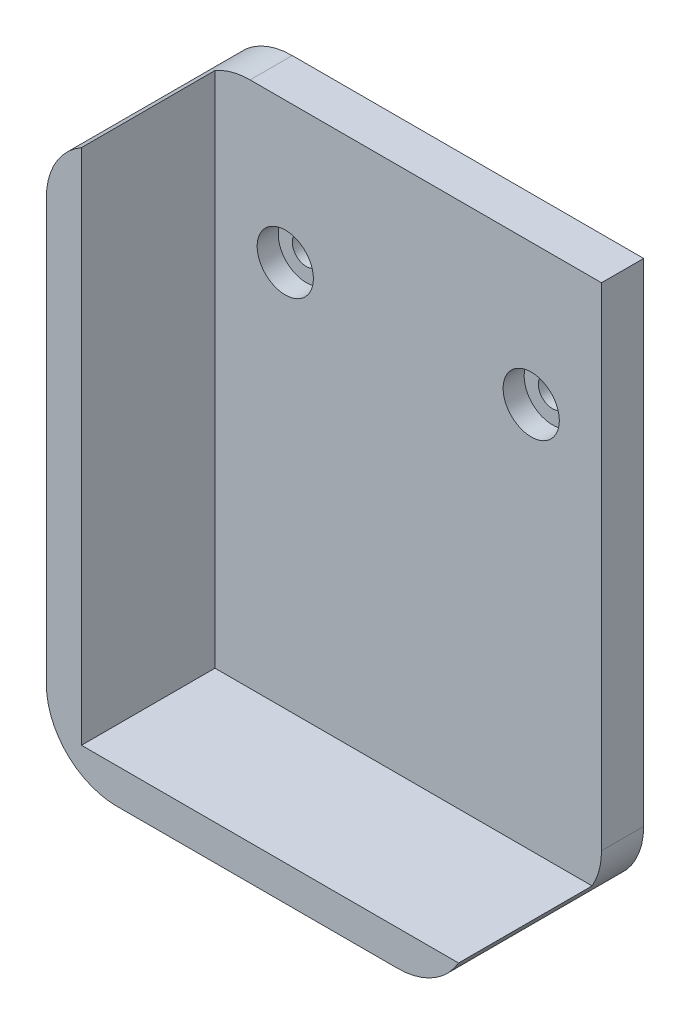
ISO-10303-21;
HEADER;
FILE_DESCRIPTION(('STEP AP214'),'2;1');
FILE_NAME('part.step','',(''),(''),'','','');
FILE_SCHEMA(('AUTOMOTIVE_DESIGN { 1 0 10303 214 1 1 1 1 }'));
ENDSEC;
DATA;
#1=APPLICATION_CONTEXT('core data for automotive mechanical design processes');
#2=APPLICATION_PROTOCOL_DEFINITION('international standard','automotive_design',2000,#1);
#3=PRODUCT_CONTEXT('',#1,'mechanical');
#4=PRODUCT('Part','Part','',(#3));
#5=PRODUCT_RELATED_PRODUCT_CATEGORY('part','',(#4));
#6=PRODUCT_DEFINITION_FORMATION('','',#4);
#7=PRODUCT_DEFINITION_CONTEXT('part definition',#1,'design');
#8=PRODUCT_DEFINITION('design','',#6,#7);
#9=PRODUCT_DEFINITION_SHAPE('','',#8);
#10=(LENGTH_UNIT() NAMED_UNIT(*) SI_UNIT(.MILLI.,.METRE.));
#11=(NAMED_UNIT(*) PLANE_ANGLE_UNIT() SI_UNIT($,.RADIAN.));
#12=(NAMED_UNIT(*) SI_UNIT($,.STERADIAN.) SOLID_ANGLE_UNIT());
#13=UNCERTAINTY_MEASURE_WITH_UNIT(LENGTH_MEASURE(1.E-05),#10,'distance_accuracy_value','');
#14=(GEOMETRIC_REPRESENTATION_CONTEXT(3) GLOBAL_UNCERTAINTY_ASSIGNED_CONTEXT((#13)) GLOBAL_UNIT_ASSIGNED_CONTEXT((#10,
#11,#12)) REPRESENTATION_CONTEXT('',''));
#15=CARTESIAN_POINT('',(0.,0.,0.));
#16=DIRECTION('',(0.,0.,1.));
#17=DIRECTION('',(1.,0.,0.));
#18=AXIS2_PLACEMENT_3D('',#15,#16,#17);
#19=CARTESIAN_POINT('',(60.,0.,6.));
#20=DIRECTION('',(1.,0.,0.));
#21=DIRECTION('',(0.,1.,0.));
#22=AXIS2_PLACEMENT_3D('',#19,#20,#21);
#23=PLANE('',#22);
#24=DIRECTION('',(0.,-1.,0.));
#25=VECTOR('',#24,1.);
#26=CARTESIAN_POINT('',(60.,0.,6.));
#27=LINE('',#26,#25);
#28=CARTESIAN_POINT('',(60.,80.,6.));
#29=VERTEX_POINT('',#28);
#30=CARTESIAN_POINT('',(60.,10.,6.));
#31=VERTEX_POINT('',#30);
#32=EDGE_CURVE('E153',#29,#31,#27,.T.);
#33=ORIENTED_EDGE('',*,*,#32,.T.);
#34=DIRECTION('',(0.,0.,-1.));
#35=VECTOR('',#34,1.);
#36=CARTESIAN_POINT('',(60.,10.,0.));
#37=LINE('',#36,#35);
#38=CARTESIAN_POINT('',(60.,10.,0.));
#39=VERTEX_POINT('',#38);
#40=EDGE_CURVE('E177',#31,#39,#37,.T.);
#41=ORIENTED_EDGE('',*,*,#40,.T.);
#42=DIRECTION('',(0.,-1.,0.));
#43=VECTOR('',#42,1.);
#44=CARTESIAN_POINT('',(60.,0.,0.));
#45=LINE('',#44,#43);
#46=CARTESIAN_POINT('',(60.,80.,0.));
#47=VERTEX_POINT('',#46);
#48=EDGE_CURVE('E152',#47,#39,#45,.T.);
#49=ORIENTED_EDGE('',*,*,#48,.F.);
#50=DIRECTION('',(0.,0.,-1.));
#51=VECTOR('',#50,1.);
#52=CARTESIAN_POINT('',(60.,80.,6.));
#53=LINE('',#52,#51);
#54=EDGE_CURVE('E159',#29,#47,#53,.T.);
#55=ORIENTED_EDGE('',*,*,#54,.F.);
#56=EDGE_LOOP('',(#33,#41,#49,#55));
#57=FACE_BOUND('',#56,.T.);
#58=ADVANCED_FACE('F39',(#57),#23,.T.);
#59=CARTESIAN_POINT('',(0.,80.,6.));
#60=DIRECTION('',(0.,1.,0.));
#61=DIRECTION('',(0.,0.,1.));
#62=AXIS2_PLACEMENT_3D('',#59,#60,#61);
#63=PLANE('',#62);
#64=DIRECTION('',(1.,0.,0.));
#65=VECTOR('',#64,1.);
#66=CARTESIAN_POINT('',(0.,80.,0.));
#67=LINE('',#66,#65);
#68=CARTESIAN_POINT('',(10.,80.,0.));
#69=VERTEX_POINT('',#68);
#70=EDGE_CURVE('E162',#69,#47,#67,.T.);
#71=ORIENTED_EDGE('',*,*,#70,.F.);
#72=DIRECTION('',(0.,0.,-1.));
#73=VECTOR('',#72,1.);
#74=CARTESIAN_POINT('',(10.,80.,6.));
#75=LINE('',#74,#73);
#76=CARTESIAN_POINT('',(10.,80.,6.));
#77=VERTEX_POINT('',#76);
#78=EDGE_CURVE('E47',#69,#77,#75,.F.);
#79=ORIENTED_EDGE('',*,*,#78,.T.);
#80=DIRECTION('',(1.,0.,0.));
#81=VECTOR('',#80,1.);
#82=CARTESIAN_POINT('',(0.,80.,6.));
#83=LINE('',#82,#81);
#84=EDGE_CURVE('E156',#77,#29,#83,.T.);
#85=ORIENTED_EDGE('',*,*,#84,.T.);
#86=ORIENTED_EDGE('',*,*,#54,.T.);
#87=EDGE_LOOP('',(#71,#79,#85,#86));
#88=FACE_BOUND('',#87,.T.);
#89=ADVANCED_FACE('F238',(#88),#63,.T.);
#90=CARTESIAN_POINT('',(0.,0.,6.));
#91=DIRECTION('',(-1.,0.,0.));
#92=DIRECTION('',(0.,0.,1.));
#93=AXIS2_PLACEMENT_3D('',#90,#91,#92);
#94=PLANE('',#93);
#95=DIRECTION('',(0.,1.,0.));
#96=VECTOR('',#95,1.);
#97=CARTESIAN_POINT('',(0.,0.,25.));
#98=LINE('',#97,#96);
#99=CARTESIAN_POINT('',(0.,10.,25.));
#100=VERTEX_POINT('',#99);
#101=CARTESIAN_POINT('',(0.,70.,25.));
#102=VERTEX_POINT('',#101);
#103=EDGE_CURVE('E124',#100,#102,#98,.T.);
#104=ORIENTED_EDGE('',*,*,#103,.T.);
#105=DIRECTION('',(0.,0.,-1.));
#106=VECTOR('',#105,1.);
#107=CARTESIAN_POINT('',(0.,70.,6.));
#108=LINE('',#107,#106);
#109=CARTESIAN_POINT('',(0.,70.,0.));
#110=VERTEX_POINT('',#109);
#111=EDGE_CURVE('E203',#102,#110,#108,.T.);
#112=ORIENTED_EDGE('',*,*,#111,.T.);
#113=DIRECTION('',(0.,1.,0.));
#114=VECTOR('',#113,1.);
#115=CARTESIAN_POINT('',(0.,0.,0.));
#116=LINE('',#115,#114);
#117=CARTESIAN_POINT('',(0.,10.,0.));
#118=VERTEX_POINT('',#117);
#119=EDGE_CURVE('E164',#118,#110,#116,.T.);
#120=ORIENTED_EDGE('',*,*,#119,.F.);
#121=DIRECTION('',(0.,0.,-1.));
#122=VECTOR('',#121,1.);
#123=CARTESIAN_POINT('',(0.,10.,25.));
#124=LINE('',#123,#122);
#125=EDGE_CURVE('E201',#118,#100,#124,.F.);
#126=ORIENTED_EDGE('',*,*,#125,.T.);
#127=EDGE_LOOP('',(#104,#112,#120,#126));
#128=FACE_BOUND('',#127,.T.);
#129=ADVANCED_FACE('F208',(#128),#94,.T.);
#130=CARTESIAN_POINT('',(0.,0.,6.));
#131=DIRECTION('',(0.,1.,0.));
#132=DIRECTION('',(0.,0.,1.));
#133=AXIS2_PLACEMENT_3D('',#130,#131,#132);
#134=PLANE('',#133);
#135=DIRECTION('',(1.,0.,0.));
#136=VECTOR('',#135,1.);
#137=CARTESIAN_POINT('',(0.,0.,0.));
#138=LINE('',#137,#136);
#139=CARTESIAN_POINT('',(10.,0.,0.));
#140=VERTEX_POINT('',#139);
#141=CARTESIAN_POINT('',(50.,0.,0.));
#142=VERTEX_POINT('',#141);
#143=EDGE_CURVE('E157',#140,#142,#138,.T.);
#144=ORIENTED_EDGE('',*,*,#143,.T.);
#145=DIRECTION('',(0.,0.,-1.));
#146=VECTOR('',#145,1.);
#147=CARTESIAN_POINT('',(50.,0.,25.));
#148=LINE('',#147,#146);
#149=CARTESIAN_POINT('',(50.,0.,25.));
#150=VERTEX_POINT('',#149);
#151=EDGE_CURVE('E189',#142,#150,#148,.F.);
#152=ORIENTED_EDGE('',*,*,#151,.T.);
#153=DIRECTION('',(1.,0.,0.));
#154=VECTOR('',#153,1.);
#155=CARTESIAN_POINT('',(0.,0.,25.));
#156=LINE('',#155,#154);
#157=CARTESIAN_POINT('',(10.,0.,25.));
#158=VERTEX_POINT('',#157);
#159=EDGE_CURVE('E134',#158,#150,#156,.T.);
#160=ORIENTED_EDGE('',*,*,#159,.F.);
#161=DIRECTION('',(0.,0.,-1.));
#162=VECTOR('',#161,1.);
#163=CARTESIAN_POINT('',(10.,0.,0.));
#164=LINE('',#163,#162);
#165=EDGE_CURVE('E186',#158,#140,#164,.T.);
#166=ORIENTED_EDGE('',*,*,#165,.T.);
#167=EDGE_LOOP('',(#144,#152,#160,#166));
#168=FACE_BOUND('',#167,.T.);
#169=ADVANCED_FACE('F221',(#168),#134,.F.);
#170=CARTESIAN_POINT('',(0.,0.,6.));
#171=DIRECTION('',(0.,0.,1.));
#172=DIRECTION('',(1.,0.,0.));
#173=AXIS2_PLACEMENT_3D('',#170,#171,#172);
#174=PLANE('',#173);
#175=CARTESIAN_POINT('',(50.,60.,6.));
#176=DIRECTION('',(0.,0.,1.));
#177=DIRECTION('',(1.,0.,0.));
#178=AXIS2_PLACEMENT_3D('',#175,#176,#177);
#179=CIRCLE('',#178,4.00000000000001);
#180=CARTESIAN_POINT('',(54.,60.,6.));
#181=VERTEX_POINT('',#180);
#182=EDGE_CURVE('E140',#181,#181,#179,.F.);
#183=ORIENTED_EDGE('',*,*,#182,.T.);
#184=EDGE_LOOP('',(#183));
#185=FACE_BOUND('',#184,.T.);
#186=CARTESIAN_POINT('',(15.,60.,6.));
#187=DIRECTION('',(0.,0.,1.));
#188=DIRECTION('',(1.,0.,0.));
#189=AXIS2_PLACEMENT_3D('',#186,#187,#188);
#190=CIRCLE('',#189,3.99999999999999);
#191=CARTESIAN_POINT('',(19.,60.,6.));
#192=VERTEX_POINT('',#191);
#193=EDGE_CURVE('E143',#192,#192,#190,.F.);
#194=ORIENTED_EDGE('',*,*,#193,.T.);
#195=EDGE_LOOP('',(#194));
#196=FACE_BOUND('',#195,.T.);
#197=DIRECTION('',(-1.,0.,0.));
#198=VECTOR('',#197,1.);
#199=CARTESIAN_POINT('',(0.,5.,6.));
#200=LINE('',#199,#198);
#201=CARTESIAN_POINT('',(58.6602540378444,5.,6.));
#202=VERTEX_POINT('',#201);
#203=CARTESIAN_POINT('',(5.,5.,6.));
#204=VERTEX_POINT('',#203);
#205=EDGE_CURVE('E132',#202,#204,#200,.T.);
#206=ORIENTED_EDGE('',*,*,#205,.F.);
#207=CARTESIAN_POINT('',(50.,10.,6.));
#208=DIRECTION('',(0.,0.,1.));
#209=DIRECTION('',(1.,0.,0.));
#210=AXIS2_PLACEMENT_3D('',#207,#208,#209);
#211=CIRCLE('',#210,10.);
#212=EDGE_CURVE('E199',#202,#31,#211,.T.);
#213=ORIENTED_EDGE('',*,*,#212,.T.);
#214=ORIENTED_EDGE('',*,*,#32,.F.);
#215=ORIENTED_EDGE('',*,*,#84,.F.);
#216=CARTESIAN_POINT('',(10.,70.,6.));
#217=DIRECTION('',(0.,0.,1.));
#218=DIRECTION('',(1.,0.,0.));
#219=AXIS2_PLACEMENT_3D('',#216,#217,#218);
#220=CIRCLE('',#219,10.);
#221=CARTESIAN_POINT('',(4.99999999999999,78.6602540378444,6.));
#222=VERTEX_POINT('',#221);
#223=EDGE_CURVE('E54',#77,#222,#220,.T.);
#224=ORIENTED_EDGE('',*,*,#223,.T.);
#225=DIRECTION('',(0.,1.,0.));
#226=VECTOR('',#225,1.);
#227=CARTESIAN_POINT('',(5.,0.,6.));
#228=LINE('',#227,#226);
#229=EDGE_CURVE('E133',#204,#222,#228,.T.);
#230=ORIENTED_EDGE('',*,*,#229,.F.);
#231=EDGE_LOOP('',(#206,#213,#214,#215,#224,#230));
#232=FACE_BOUND('',#231,.T.);
#233=ADVANCED_FACE('F227',(#185,#196,#232),#174,.T.);
#234=CARTESIAN_POINT('',(0.,0.,0.));
#235=DIRECTION('',(0.,0.,1.));
#236=DIRECTION('',(1.,0.,0.));
#237=AXIS2_PLACEMENT_3D('',#234,#235,#236);
#238=PLANE('',#237);
#239=ORIENTED_EDGE('',*,*,#48,.T.);
#240=CARTESIAN_POINT('',(50.,10.,0.));
#241=DIRECTION('',(0.,0.,1.));
#242=DIRECTION('',(1.,0.,0.));
#243=AXIS2_PLACEMENT_3D('',#240,#241,#242);
#244=CIRCLE('',#243,10.);
#245=EDGE_CURVE('E184',#39,#142,#244,.F.);
#246=ORIENTED_EDGE('',*,*,#245,.T.);
#247=ORIENTED_EDGE('',*,*,#143,.F.);
#248=CARTESIAN_POINT('',(10.,10.,0.));
#249=DIRECTION('',(0.,0.,1.));
#250=DIRECTION('',(1.,0.,0.));
#251=AXIS2_PLACEMENT_3D('',#248,#249,#250);
#252=CIRCLE('',#251,10.);
#253=EDGE_CURVE('E180',#140,#118,#252,.F.);
#254=ORIENTED_EDGE('',*,*,#253,.T.);
#255=ORIENTED_EDGE('',*,*,#119,.T.);
#256=CARTESIAN_POINT('',(10.,70.,0.));
#257=DIRECTION('',(0.,0.,1.));
#258=DIRECTION('',(1.,0.,0.));
#259=AXIS2_PLACEMENT_3D('',#256,#257,#258);
#260=CIRCLE('',#259,10.);
#261=EDGE_CURVE('E182',#110,#69,#260,.F.);
#262=ORIENTED_EDGE('',*,*,#261,.T.);
#263=ORIENTED_EDGE('',*,*,#70,.T.);
#264=EDGE_LOOP('',(#239,#246,#247,#254,#255,#262,#263));
#265=FACE_BOUND('',#264,.T.);
#266=CARTESIAN_POINT('',(50.,60.,0.));
#267=DIRECTION('',(0.,0.,1.));
#268=DIRECTION('',(1.,0.,0.));
#269=AXIS2_PLACEMENT_3D('',#266,#267,#268);
#270=CIRCLE('',#269,2.);
#271=CARTESIAN_POINT('',(52.,60.,0.));
#272=VERTEX_POINT('',#271);
#273=EDGE_CURVE('E296',#272,#272,#270,.T.);
#274=ORIENTED_EDGE('',*,*,#273,.T.);
#275=EDGE_LOOP('',(#274));
#276=FACE_BOUND('',#275,.T.);
#277=CARTESIAN_POINT('',(15.,60.,0.));
#278=DIRECTION('',(0.,0.,1.));
#279=DIRECTION('',(1.,0.,0.));
#280=AXIS2_PLACEMENT_3D('',#277,#278,#279);
#281=CIRCLE('',#280,2.00000000000001);
#282=CARTESIAN_POINT('',(17.,60.,0.));
#283=VERTEX_POINT('',#282);
#284=EDGE_CURVE('E301',#283,#283,#281,.T.);
#285=ORIENTED_EDGE('',*,*,#284,.T.);
#286=EDGE_LOOP('',(#285));
#287=FACE_BOUND('',#286,.T.);
#288=ADVANCED_FACE('F213',(#265,#276,#287),#238,.F.);
#289=CARTESIAN_POINT('',(0.,5.,25.));
#290=DIRECTION('',(0.,1.,0.));
#291=DIRECTION('',(0.,0.,1.));
#292=AXIS2_PLACEMENT_3D('',#289,#290,#291);
#293=PLANE('',#292);
#294=DIRECTION('',(1.,0.,0.));
#295=VECTOR('',#294,1.);
#296=CARTESIAN_POINT('',(0.,5.,25.));
#297=LINE('',#296,#295);
#298=CARTESIAN_POINT('',(5.,5.,25.));
#299=VERTEX_POINT('',#298);
#300=CARTESIAN_POINT('',(58.6602540378444,5.,25.));
#301=VERTEX_POINT('',#300);
#302=EDGE_CURVE('E125',#299,#301,#297,.T.);
#303=ORIENTED_EDGE('',*,*,#302,.T.);
#304=DIRECTION('',(0.,0.,1.));
#305=VECTOR('',#304,1.);
#306=CARTESIAN_POINT('',(58.6602540378444,5.,25.));
#307=LINE('',#306,#305);
#308=EDGE_CURVE('E196',#301,#202,#307,.F.);
#309=ORIENTED_EDGE('',*,*,#308,.T.);
#310=ORIENTED_EDGE('',*,*,#205,.T.);
#311=DIRECTION('',(0.,0.,-1.));
#312=VECTOR('',#311,1.);
#313=CARTESIAN_POINT('',(5.,5.,25.));
#314=LINE('',#313,#312);
#315=EDGE_CURVE('E119',#299,#204,#314,.T.);
#316=ORIENTED_EDGE('',*,*,#315,.F.);
#317=EDGE_LOOP('',(#303,#309,#310,#316));
#318=FACE_BOUND('',#317,.T.);
#319=ADVANCED_FACE('F129',(#318),#293,.T.);
#320=CARTESIAN_POINT('',(5.,0.,25.));
#321=DIRECTION('',(1.,0.,0.));
#322=DIRECTION('',(0.,1.,0.));
#323=AXIS2_PLACEMENT_3D('',#320,#321,#322);
#324=PLANE('',#323);
#325=ORIENTED_EDGE('',*,*,#229,.T.);
#326=DIRECTION('',(0.,0.,-1.));
#327=VECTOR('',#326,1.);
#328=CARTESIAN_POINT('',(4.99999999999999,78.6602540378444,6.));
#329=LINE('',#328,#327);
#330=CARTESIAN_POINT('',(4.99999999999999,78.6602540378444,25.));
#331=VERTEX_POINT('',#330);
#332=EDGE_CURVE('E11',#222,#331,#329,.F.);
#333=ORIENTED_EDGE('',*,*,#332,.T.);
#334=DIRECTION('',(0.,-1.,0.));
#335=VECTOR('',#334,1.);
#336=CARTESIAN_POINT('',(5.,0.,25.));
#337=LINE('',#336,#335);
#338=EDGE_CURVE('E116',#331,#299,#337,.T.);
#339=ORIENTED_EDGE('',*,*,#338,.T.);
#340=ORIENTED_EDGE('',*,*,#315,.T.);
#341=EDGE_LOOP('',(#325,#333,#339,#340));
#342=FACE_BOUND('',#341,.T.);
#343=ADVANCED_FACE('F118',(#342),#324,.T.);
#344=CARTESIAN_POINT('',(0.,0.,25.));
#345=DIRECTION('',(0.,0.,1.));
#346=DIRECTION('',(1.,0.,0.));
#347=AXIS2_PLACEMENT_3D('',#344,#345,#346);
#348=PLANE('',#347);
#349=ORIENTED_EDGE('',*,*,#159,.T.);
#350=CARTESIAN_POINT('',(50.,10.,25.));
#351=DIRECTION('',(0.,0.,1.));
#352=DIRECTION('',(1.,0.,0.));
#353=AXIS2_PLACEMENT_3D('',#350,#351,#352);
#354=CIRCLE('',#353,10.);
#355=EDGE_CURVE('E139',#150,#301,#354,.T.);
#356=ORIENTED_EDGE('',*,*,#355,.T.);
#357=ORIENTED_EDGE('',*,*,#302,.F.);
#358=ORIENTED_EDGE('',*,*,#338,.F.);
#359=CARTESIAN_POINT('',(10.,70.,25.));
#360=DIRECTION('',(0.,0.,1.));
#361=DIRECTION('',(1.,0.,0.));
#362=AXIS2_PLACEMENT_3D('',#359,#360,#361);
#363=CIRCLE('',#362,10.);
#364=EDGE_CURVE('E193',#331,#102,#363,.T.);
#365=ORIENTED_EDGE('',*,*,#364,.T.);
#366=ORIENTED_EDGE('',*,*,#103,.F.);
#367=CARTESIAN_POINT('',(10.,10.,25.));
#368=DIRECTION('',(0.,0.,1.));
#369=DIRECTION('',(1.,0.,0.));
#370=AXIS2_PLACEMENT_3D('',#367,#368,#369);
#371=CIRCLE('',#370,10.);
#372=EDGE_CURVE('E191',#100,#158,#371,.T.);
#373=ORIENTED_EDGE('',*,*,#372,.T.);
#374=EDGE_LOOP('',(#349,#356,#357,#358,#365,#366,#373));
#375=FACE_BOUND('',#374,.T.);
#376=ADVANCED_FACE('F137',(#375),#348,.T.);
#377=CARTESIAN_POINT('',(15.,60.,25.));
#378=DIRECTION('',(0.,0.,-1.));
#379=DIRECTION('',(-1.,0.,0.));
#380=AXIS2_PLACEMENT_3D('',#377,#378,#379);
#381=CYLINDRICAL_SURFACE('',#380,3.99999999999999);
#382=CARTESIAN_POINT('',(15.,60.,3.));
#383=DIRECTION('',(0.,0.,1.));
#384=DIRECTION('',(1.,0.,0.));
#385=AXIS2_PLACEMENT_3D('',#382,#383,#384);
#386=CIRCLE('',#385,3.99999999999999);
#387=CARTESIAN_POINT('',(19.,60.,3.));
#388=VERTEX_POINT('',#387);
#389=EDGE_CURVE('E174',#388,#388,#386,.T.);
#390=ORIENTED_EDGE('',*,*,#389,.F.);
#391=EDGE_LOOP('',(#390));
#392=FACE_BOUND('',#391,.T.);
#393=ORIENTED_EDGE('',*,*,#193,.F.);
#394=EDGE_LOOP('',(#393));
#395=FACE_BOUND('',#394,.T.);
#396=ADVANCED_FACE('F261',(#392,#395),#381,.F.);
#397=CARTESIAN_POINT('',(50.,60.,25.));
#398=DIRECTION('',(0.,0.,-1.));
#399=DIRECTION('',(-1.,0.,0.));
#400=AXIS2_PLACEMENT_3D('',#397,#398,#399);
#401=CYLINDRICAL_SURFACE('',#400,4.00000000000001);
#402=CARTESIAN_POINT('',(50.,60.,3.));
#403=DIRECTION('',(0.,0.,1.));
#404=DIRECTION('',(1.,0.,0.));
#405=AXIS2_PLACEMENT_3D('',#402,#403,#404);
#406=CIRCLE('',#405,4.00000000000001);
#407=CARTESIAN_POINT('',(54.,60.,3.));
#408=VERTEX_POINT('',#407);
#409=EDGE_CURVE('E171',#408,#408,#406,.T.);
#410=ORIENTED_EDGE('',*,*,#409,.F.);
#411=EDGE_LOOP('',(#410));
#412=FACE_BOUND('',#411,.T.);
#413=ORIENTED_EDGE('',*,*,#182,.F.);
#414=EDGE_LOOP('',(#413));
#415=FACE_BOUND('',#414,.T.);
#416=ADVANCED_FACE('F264',(#412,#415),#401,.F.);
#417=CARTESIAN_POINT('',(50.,60.,3.));
#418=DIRECTION('',(0.,0.,-1.));
#419=DIRECTION('',(-1.,0.,0.));
#420=AXIS2_PLACEMENT_3D('',#417,#418,#419);
#421=CYLINDRICAL_SURFACE('',#420,2.);
#422=CARTESIAN_POINT('',(50.,60.,3.));
#423=DIRECTION('',(0.,0.,1.));
#424=DIRECTION('',(1.,0.,0.));
#425=AXIS2_PLACEMENT_3D('',#422,#423,#424);
#426=CIRCLE('',#425,2.);
#427=CARTESIAN_POINT('',(52.,60.,3.));
#428=VERTEX_POINT('',#427);
#429=EDGE_CURVE('E294',#428,#428,#426,.T.);
#430=ORIENTED_EDGE('',*,*,#429,.T.);
#431=EDGE_LOOP('',(#430));
#432=FACE_BOUND('',#431,.T.);
#433=ORIENTED_EDGE('',*,*,#273,.F.);
#434=EDGE_LOOP('',(#433));
#435=FACE_BOUND('',#434,.T.);
#436=ADVANCED_FACE('F268',(#432,#435),#421,.F.);
#437=CARTESIAN_POINT('',(0.,0.,3.));
#438=DIRECTION('',(0.,0.,1.));
#439=DIRECTION('',(1.,0.,0.));
#440=AXIS2_PLACEMENT_3D('',#437,#438,#439);
#441=PLANE('',#440);
#442=ORIENTED_EDGE('',*,*,#429,.F.);
#443=EDGE_LOOP('',(#442));
#444=FACE_BOUND('',#443,.T.);
#445=ORIENTED_EDGE('',*,*,#409,.T.);
#446=EDGE_LOOP('',(#445));
#447=FACE_BOUND('',#446,.T.);
#448=ADVANCED_FACE('F272',(#444,#447),#441,.T.);
#449=CARTESIAN_POINT('',(15.,60.,3.));
#450=DIRECTION('',(0.,0.,-1.));
#451=DIRECTION('',(-1.,0.,0.));
#452=AXIS2_PLACEMENT_3D('',#449,#450,#451);
#453=CYLINDRICAL_SURFACE('',#452,2.00000000000001);
#454=CARTESIAN_POINT('',(15.,60.,3.));
#455=DIRECTION('',(0.,0.,1.));
#456=DIRECTION('',(1.,0.,0.));
#457=AXIS2_PLACEMENT_3D('',#454,#455,#456);
#458=CIRCLE('',#457,2.00000000000001);
#459=CARTESIAN_POINT('',(17.,60.,3.));
#460=VERTEX_POINT('',#459);
#461=EDGE_CURVE('E288',#460,#460,#458,.T.);
#462=ORIENTED_EDGE('',*,*,#461,.T.);
#463=EDGE_LOOP('',(#462));
#464=FACE_BOUND('',#463,.T.);
#465=ORIENTED_EDGE('',*,*,#284,.F.);
#466=EDGE_LOOP('',(#465));
#467=FACE_BOUND('',#466,.T.);
#468=ADVANCED_FACE('F276',(#464,#467),#453,.F.);
#469=CARTESIAN_POINT('',(0.,0.,3.));
#470=DIRECTION('',(0.,0.,1.));
#471=DIRECTION('',(1.,0.,0.));
#472=AXIS2_PLACEMENT_3D('',#469,#470,#471);
#473=PLANE('',#472);
#474=ORIENTED_EDGE('',*,*,#461,.F.);
#475=EDGE_LOOP('',(#474));
#476=FACE_BOUND('',#475,.T.);
#477=ORIENTED_EDGE('',*,*,#389,.T.);
#478=EDGE_LOOP('',(#477));
#479=FACE_BOUND('',#478,.T.);
#480=ADVANCED_FACE('F235',(#476,#479),#473,.T.);
#481=CARTESIAN_POINT('',(50.,10.,6.));
#482=DIRECTION('',(0.,0.,1.));
#483=DIRECTION('',(1.,0.,0.));
#484=AXIS2_PLACEMENT_3D('',#481,#482,#483);
#485=CYLINDRICAL_SURFACE('',#484,10.);
#486=ORIENTED_EDGE('',*,*,#355,.F.);
#487=ORIENTED_EDGE('',*,*,#151,.F.);
#488=ORIENTED_EDGE('',*,*,#245,.F.);
#489=ORIENTED_EDGE('',*,*,#40,.F.);
#490=ORIENTED_EDGE('',*,*,#212,.F.);
#491=ORIENTED_EDGE('',*,*,#308,.F.);
#492=EDGE_LOOP('',(#486,#487,#488,#489,#490,#491));
#493=FACE_BOUND('',#492,.T.);
#494=ADVANCED_FACE('F224',(#493),#485,.T.);
#495=CARTESIAN_POINT('',(10.,70.,6.));
#496=DIRECTION('',(0.,0.,-1.));
#497=DIRECTION('',(-1.,0.,0.));
#498=AXIS2_PLACEMENT_3D('',#495,#496,#497);
#499=CYLINDRICAL_SURFACE('',#498,10.);
#500=ORIENTED_EDGE('',*,*,#223,.F.);
#501=ORIENTED_EDGE('',*,*,#78,.F.);
#502=ORIENTED_EDGE('',*,*,#261,.F.);
#503=ORIENTED_EDGE('',*,*,#111,.F.);
#504=ORIENTED_EDGE('',*,*,#364,.F.);
#505=ORIENTED_EDGE('',*,*,#332,.F.);
#506=EDGE_LOOP('',(#500,#501,#502,#503,#504,#505));
#507=FACE_BOUND('',#506,.T.);
#508=ADVANCED_FACE('F229',(#507),#499,.T.);
#509=CARTESIAN_POINT('',(10.,10.,6.));
#510=DIRECTION('',(0.,0.,1.));
#511=DIRECTION('',(1.,0.,0.));
#512=AXIS2_PLACEMENT_3D('',#509,#510,#511);
#513=CYLINDRICAL_SURFACE('',#512,10.);
#514=ORIENTED_EDGE('',*,*,#372,.F.);
#515=ORIENTED_EDGE('',*,*,#125,.F.);
#516=ORIENTED_EDGE('',*,*,#253,.F.);
#517=ORIENTED_EDGE('',*,*,#165,.F.);
#518=EDGE_LOOP('',(#514,#515,#516,#517));
#519=FACE_BOUND('',#518,.T.);
#520=ADVANCED_FACE('F41',(#519),#513,.T.);
#521=CLOSED_SHELL('',(#58,#89,#129,#169,#233,#288,#319,#343,#376,#396,#416,#436,#448,#468,#480,
#494,#508,#520));
#522=MANIFOLD_SOLID_BREP('B2',#521);
#523=ADVANCED_BREP_SHAPE_REPRESENTATION('',(#18,#522),#14);
#524=SHAPE_DEFINITION_REPRESENTATION(#9,#523);
ENDSEC;
END-ISO-10303-21;
